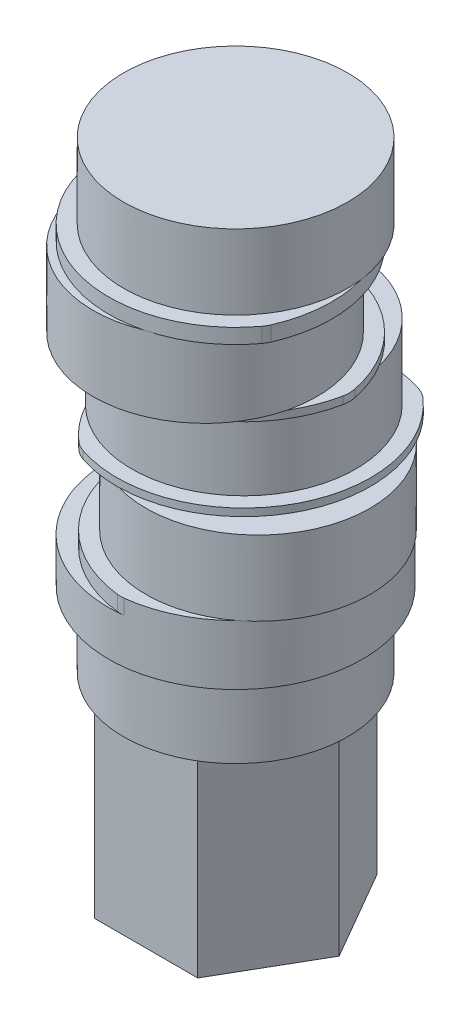
ISO-10303-21;
HEADER;
FILE_DESCRIPTION(('STEP AP214'),'2;1');
FILE_NAME('part.step','',(''),(''),'','','');
FILE_SCHEMA(('AUTOMOTIVE_DESIGN { 1 0 10303 214 1 1 1 1 }'));
ENDSEC;
DATA;
#1=APPLICATION_CONTEXT('core data for automotive mechanical design processes');
#2=APPLICATION_PROTOCOL_DEFINITION('international standard','automotive_design',2000,#1);
#3=PRODUCT_CONTEXT('',#1,'mechanical');
#4=PRODUCT('Part','Part','',(#3));
#5=PRODUCT_RELATED_PRODUCT_CATEGORY('part','',(#4));
#6=PRODUCT_DEFINITION_FORMATION('','',#4);
#7=PRODUCT_DEFINITION_CONTEXT('part definition',#1,'design');
#8=PRODUCT_DEFINITION('design','',#6,#7);
#9=PRODUCT_DEFINITION_SHAPE('','',#8);
#10=(LENGTH_UNIT() NAMED_UNIT(*) SI_UNIT(.MILLI.,.METRE.));
#11=(NAMED_UNIT(*) PLANE_ANGLE_UNIT() SI_UNIT($,.RADIAN.));
#12=(NAMED_UNIT(*) SI_UNIT($,.STERADIAN.) SOLID_ANGLE_UNIT());
#13=UNCERTAINTY_MEASURE_WITH_UNIT(LENGTH_MEASURE(1.E-05),#10,'distance_accuracy_value','');
#14=(GEOMETRIC_REPRESENTATION_CONTEXT(3) GLOBAL_UNCERTAINTY_ASSIGNED_CONTEXT((#13)) GLOBAL_UNIT_ASSIGNED_CONTEXT((#10,
#11,#12)) REPRESENTATION_CONTEXT('',''));
#15=CARTESIAN_POINT('',(0.,0.,0.));
#16=DIRECTION('',(0.,0.,1.));
#17=DIRECTION('',(1.,0.,0.));
#18=AXIS2_PLACEMENT_3D('',#15,#16,#17);
#19=CARTESIAN_POINT('',(0.,21.,0.));
#20=DIRECTION('',(0.,1.,0.));
#21=DIRECTION('',(0.,0.,1.));
#22=AXIS2_PLACEMENT_3D('',#19,#20,#21);
#23=PLANE('',#22);
#24=CARTESIAN_POINT('',(1.5,21.,0.));
#25=DIRECTION('',(0.,1.,0.));
#26=DIRECTION('',(0.,0.,1.));
#27=AXIS2_PLACEMENT_3D('',#24,#25,#26);
#28=CIRCLE('',#27,8.5);
#29=CARTESIAN_POINT('',(0.519230769230769,21.,-8.44322756509478));
#30=VERTEX_POINT('',#29);
#31=CARTESIAN_POINT('',(0.519230769230769,21.,8.44322756509478));
#32=VERTEX_POINT('',#31);
#33=EDGE_CURVE('E233',#30,#32,#28,.T.);
#34=ORIENTED_EDGE('',*,*,#33,.F.);
#35=CARTESIAN_POINT('',(0.75,21.,-6.45658578507248));
#36=DIRECTION('',(0.,1.,0.));
#37=DIRECTION('',(0.,0.,1.));
#38=AXIS2_PLACEMENT_3D('',#35,#36,#37);
#39=CIRCLE('',#38,2.);
#40=CARTESIAN_POINT('',(0.980769230769231,21.,-8.44322756509478));
#41=VERTEX_POINT('',#40);
#42=EDGE_CURVE('E260',#30,#41,#39,.F.);
#43=ORIENTED_EDGE('',*,*,#42,.T.);
#44=CARTESIAN_POINT('',(0.,21.,0.));
#45=DIRECTION('',(0.,-1.,0.));
#46=DIRECTION('',(0.,0.,-1.));
#47=AXIS2_PLACEMENT_3D('',#44,#45,#46);
#48=CIRCLE('',#47,8.5);
#49=CARTESIAN_POINT('',(0.980769230769231,21.,8.44322756509478));
#50=VERTEX_POINT('',#49);
#51=EDGE_CURVE('E259',#50,#41,#48,.T.);
#52=ORIENTED_EDGE('',*,*,#51,.F.);
#53=CARTESIAN_POINT('',(0.75,21.,6.45658578507248));
#54=DIRECTION('',(0.,1.,0.));
#55=DIRECTION('',(0.,0.,1.));
#56=AXIS2_PLACEMENT_3D('',#53,#54,#55);
#57=CIRCLE('',#56,2.);
#58=EDGE_CURVE('E252',#50,#32,#57,.F.);
#59=ORIENTED_EDGE('',*,*,#58,.T.);
#60=EDGE_LOOP('',(#34,#43,#52,#59));
#61=FACE_BOUND('',#60,.T.);
#62=ADVANCED_FACE('F41',(#61),#23,.T.);
#63=CARTESIAN_POINT('',(1.5,22.,0.));
#64=DIRECTION('',(0.,-1.,0.));
#65=DIRECTION('',(0.,0.,-1.));
#66=AXIS2_PLACEMENT_3D('',#63,#64,#65);
#67=CYLINDRICAL_SURFACE('',#66,8.5);
#68=CARTESIAN_POINT('',(1.5,22.,0.));
#69=DIRECTION('',(0.,1.,0.));
#70=DIRECTION('',(0.,0.,1.));
#71=AXIS2_PLACEMENT_3D('',#68,#69,#70);
#72=CIRCLE('',#71,8.5);
#73=CARTESIAN_POINT('',(0.519230769230769,22.,-8.44322756509478));
#74=VERTEX_POINT('',#73);
#75=CARTESIAN_POINT('',(0.519230769230769,22.,8.44322756509478));
#76=VERTEX_POINT('',#75);
#77=EDGE_CURVE('E350',#74,#76,#72,.T.);
#78=ORIENTED_EDGE('',*,*,#77,.F.);
#79=DIRECTION('',(0.,-1.,0.));
#80=VECTOR('',#79,1.);
#81=CARTESIAN_POINT('',(0.519230769230769,22.,-8.44322756509478));
#82=LINE('',#81,#80);
#83=EDGE_CURVE('E240',#74,#30,#82,.T.);
#84=ORIENTED_EDGE('',*,*,#83,.T.);
#85=ORIENTED_EDGE('',*,*,#33,.T.);
#86=DIRECTION('',(0.,-1.,0.));
#87=VECTOR('',#86,1.);
#88=CARTESIAN_POINT('',(0.519230769230769,22.,8.44322756509478));
#89=LINE('',#88,#87);
#90=EDGE_CURVE('E237',#32,#76,#89,.F.);
#91=ORIENTED_EDGE('',*,*,#90,.T.);
#92=EDGE_LOOP('',(#78,#84,#85,#91));
#93=FACE_BOUND('',#92,.T.);
#94=ADVANCED_FACE('F236',(#93),#67,.T.);
#95=CARTESIAN_POINT('',(0.,22.,0.));
#96=DIRECTION('',(0.,-1.,0.));
#97=DIRECTION('',(0.,0.,-1.));
#98=AXIS2_PLACEMENT_3D('',#95,#96,#97);
#99=CYLINDRICAL_SURFACE('',#98,8.5);
#100=DIRECTION('',(0.,-1.,0.));
#101=VECTOR('',#100,1.);
#102=CARTESIAN_POINT('',(0.980769230769231,22.,8.44322756509478));
#103=LINE('',#102,#101);
#104=CARTESIAN_POINT('',(0.980769230769231,22.,8.44322756509478));
#105=VERTEX_POINT('',#104);
#106=EDGE_CURVE('E262',#105,#50,#103,.T.);
#107=ORIENTED_EDGE('',*,*,#106,.T.);
#108=ORIENTED_EDGE('',*,*,#51,.T.);
#109=DIRECTION('',(0.,-1.,0.));
#110=VECTOR('',#109,1.);
#111=CARTESIAN_POINT('',(0.980769230769231,22.,-8.44322756509478));
#112=LINE('',#111,#110);
#113=CARTESIAN_POINT('',(0.980769230769231,22.,-8.44322756509478));
#114=VERTEX_POINT('',#113);
#115=EDGE_CURVE('E267',#41,#114,#112,.F.);
#116=ORIENTED_EDGE('',*,*,#115,.T.);
#117=CARTESIAN_POINT('',(0.,22.,0.));
#118=DIRECTION('',(0.,1.,0.));
#119=DIRECTION('',(0.,0.,1.));
#120=AXIS2_PLACEMENT_3D('',#117,#118,#119);
#121=CIRCLE('',#120,8.5);
#122=CARTESIAN_POINT('',(6.08333333333334,22.,-5.93658618698958));
#123=VERTEX_POINT('',#122);
#124=EDGE_CURVE('E355',#123,#114,#121,.T.);
#125=ORIENTED_EDGE('',*,*,#124,.F.);
#126=CARTESIAN_POINT('',(6.08333333333334,22.,5.93658618698958));
#127=VERTEX_POINT('',#126);
#128=EDGE_CURVE('E358',#127,#123,#121,.T.);
#129=ORIENTED_EDGE('',*,*,#128,.F.);
#130=EDGE_CURVE('E356',#105,#127,#121,.T.);
#131=ORIENTED_EDGE('',*,*,#130,.F.);
#132=EDGE_LOOP('',(#107,#108,#116,#125,#129,#131));
#133=FACE_BOUND('',#132,.T.);
#134=CARTESIAN_POINT('',(0.,18.,0.));
#135=DIRECTION('',(0.,-1.,0.));
#136=DIRECTION('',(0.,0.,-1.));
#137=AXIS2_PLACEMENT_3D('',#134,#135,#136);
#138=CIRCLE('',#137,8.5);
#139=CARTESIAN_POINT('',(0.,18.,-8.5));
#140=VERTEX_POINT('',#139);
#141=EDGE_CURVE('E962',#140,#140,#138,.T.);
#142=ORIENTED_EDGE('',*,*,#141,.F.);
#143=EDGE_LOOP('',(#142));
#144=FACE_BOUND('',#143,.T.);
#145=ADVANCED_FACE('F519',(#133,#144),#99,.T.);
#146=CARTESIAN_POINT('',(0.,22.,0.));
#147=DIRECTION('',(0.,1.,0.));
#148=DIRECTION('',(0.,0.,1.));
#149=AXIS2_PLACEMENT_3D('',#146,#147,#148);
#150=PLANE('',#149);
#151=ORIENTED_EDGE('',*,*,#124,.T.);
#152=CARTESIAN_POINT('',(0.75,22.,-6.45658578507248));
#153=DIRECTION('',(0.,1.,0.));
#154=DIRECTION('',(0.,0.,1.));
#155=AXIS2_PLACEMENT_3D('',#152,#153,#154);
#156=CIRCLE('',#155,2.);
#157=EDGE_CURVE('E270',#114,#74,#156,.T.);
#158=ORIENTED_EDGE('',*,*,#157,.T.);
#159=ORIENTED_EDGE('',*,*,#77,.T.);
#160=CARTESIAN_POINT('',(0.75,22.,6.45658578507248));
#161=DIRECTION('',(0.,1.,0.));
#162=DIRECTION('',(0.,0.,1.));
#163=AXIS2_PLACEMENT_3D('',#160,#161,#162);
#164=CIRCLE('',#163,2.);
#165=EDGE_CURVE('E254',#76,#105,#164,.T.);
#166=ORIENTED_EDGE('',*,*,#165,.T.);
#167=ORIENTED_EDGE('',*,*,#130,.T.);
#168=CARTESIAN_POINT('',(1.5,22.,0.));
#169=DIRECTION('',(0.,1.,0.));
#170=DIRECTION('',(0.,0.,1.));
#171=AXIS2_PLACEMENT_3D('',#168,#169,#170);
#172=CIRCLE('',#171,7.5);
#173=EDGE_CURVE('E245',#123,#127,#172,.T.);
#174=ORIENTED_EDGE('',*,*,#173,.F.);
#175=EDGE_LOOP('',(#151,#158,#159,#166,#167,#174));
#176=FACE_BOUND('',#175,.T.);
#177=ADVANCED_FACE('F713',(#176),#150,.T.);
#178=CARTESIAN_POINT('',(1.5,22.,0.));
#179=DIRECTION('',(0.,1.,0.));
#180=DIRECTION('',(0.,0.,1.));
#181=AXIS2_PLACEMENT_3D('',#178,#179,#180);
#182=PLANE('',#181);
#183=EDGE_CURVE('E340',#127,#123,#172,.T.);
#184=ORIENTED_EDGE('',*,*,#183,.F.);
#185=ORIENTED_EDGE('',*,*,#128,.T.);
#186=EDGE_LOOP('',(#184,#185));
#187=FACE_BOUND('',#186,.T.);
#188=ADVANCED_FACE('F853',(#187),#182,.F.);
#189=CARTESIAN_POINT('',(1.5,27.,0.));
#190=DIRECTION('',(0.,-1.,0.));
#191=DIRECTION('',(0.,0.,-1.));
#192=AXIS2_PLACEMENT_3D('',#189,#190,#191);
#193=CYLINDRICAL_SURFACE('',#192,7.5);
#194=CARTESIAN_POINT('',(1.5,27.,0.));
#195=DIRECTION('',(0.,1.,0.));
#196=DIRECTION('',(0.,0.,1.));
#197=AXIS2_PLACEMENT_3D('',#194,#195,#196);
#198=CIRCLE('',#197,7.5);
#199=CARTESIAN_POINT('',(6.68450273621876,27.,-5.41949549110803));
#200=VERTEX_POINT('',#199);
#201=CARTESIAN_POINT('',(-0.601169402885409,27.,7.19965882110938));
#202=VERTEX_POINT('',#201);
#203=EDGE_CURVE('E347',#200,#202,#198,.T.);
#204=ORIENTED_EDGE('',*,*,#203,.F.);
#205=EDGE_CURVE('E351',#202,#200,#198,.T.);
#206=ORIENTED_EDGE('',*,*,#205,.F.);
#207=EDGE_LOOP('',(#204,#206));
#208=FACE_BOUND('',#207,.T.);
#209=ORIENTED_EDGE('',*,*,#183,.T.);
#210=ORIENTED_EDGE('',*,*,#173,.T.);
#211=EDGE_LOOP('',(#209,#210));
#212=FACE_BOUND('',#211,.T.);
#213=ADVANCED_FACE('F844',(#208,#212),#193,.T.);
#214=CARTESIAN_POINT('',(1.5,27.,0.));
#215=DIRECTION('',(0.,1.,0.));
#216=DIRECTION('',(0.,0.,1.));
#217=AXIS2_PLACEMENT_3D('',#214,#215,#216);
#218=PLANE('',#217);
#219=CARTESIAN_POINT('',(-0.749999999999997,27.,-1.29903810567666));
#220=DIRECTION('',(0.,1.,0.));
#221=DIRECTION('',(0.,0.,1.));
#222=AXIS2_PLACEMENT_3D('',#219,#220,#221);
#223=CIRCLE('',#222,8.5);
#224=EDGE_CURVE('E344',#202,#200,#223,.T.);
#225=ORIENTED_EDGE('',*,*,#224,.F.);
#226=ORIENTED_EDGE('',*,*,#205,.T.);
#227=EDGE_LOOP('',(#225,#226));
#228=FACE_BOUND('',#227,.T.);
#229=ADVANCED_FACE('F835',(#228),#218,.T.);
#230=CARTESIAN_POINT('',(0.,27.,0.));
#231=DIRECTION('',(0.,1.,0.));
#232=DIRECTION('',(0.,0.,1.));
#233=AXIS2_PLACEMENT_3D('',#230,#231,#232);
#234=PLANE('',#233);
#235=CARTESIAN_POINT('',(-3.44310704708787,27.,6.76304440648641));
#236=VERTEX_POINT('',#235);
#237=EDGE_CURVE('E342',#236,#202,#223,.T.);
#238=ORIENTED_EDGE('',*,*,#237,.F.);
#239=CARTESIAN_POINT('',(-2.80943480071425,27.,4.86608381538922));
#240=DIRECTION('',(0.,1.,0.));
#241=DIRECTION('',(0.,0.,1.));
#242=AXIS2_PLACEMENT_3D('',#239,#240,#241);
#243=CIRCLE('',#242,2.);
#244=CARTESIAN_POINT('',(-4.13541473939556,27.,6.36334037397052));
#245=VERTEX_POINT('',#244);
#246=EDGE_CURVE('E279',#236,#245,#243,.F.);
#247=ORIENTED_EDGE('',*,*,#246,.T.);
#248=CARTESIAN_POINT('',(1.5,27.,0.));
#249=DIRECTION('',(0.,1.,0.));
#250=DIRECTION('',(0.,0.,1.));
#251=AXIS2_PLACEMENT_3D('',#248,#249,#250);
#252=CIRCLE('',#251,8.5);
#253=CARTESIAN_POINT('',(4.19310704708788,27.,-8.06208251216307));
#254=VERTEX_POINT('',#253);
#255=EDGE_CURVE('E337',#254,#245,#252,.T.);
#256=ORIENTED_EDGE('',*,*,#255,.F.);
#257=CARTESIAN_POINT('',(3.55943480071426,27.,-6.16512192106588));
#258=DIRECTION('',(0.,1.,0.));
#259=DIRECTION('',(0.,0.,1.));
#260=AXIS2_PLACEMENT_3D('',#257,#258,#259);
#261=CIRCLE('',#260,2.);
#262=CARTESIAN_POINT('',(4.88541473939557,27.,-7.66237847964718));
#263=VERTEX_POINT('',#262);
#264=EDGE_CURVE('E277',#254,#263,#261,.F.);
#265=ORIENTED_EDGE('',*,*,#264,.T.);
#266=EDGE_CURVE('E327',#200,#263,#223,.T.);
#267=ORIENTED_EDGE('',*,*,#266,.F.);
#268=ORIENTED_EDGE('',*,*,#203,.T.);
#269=EDGE_LOOP('',(#238,#247,#256,#265,#267,#268));
#270=FACE_BOUND('',#269,.T.);
#271=ADVANCED_FACE('F825',(#270),#234,.F.);
#272=CARTESIAN_POINT('',(-0.749999999999997,27.5,-1.29903810567666));
#273=DIRECTION('',(0.,-1.,0.));
#274=DIRECTION('',(0.,0.,-1.));
#275=AXIS2_PLACEMENT_3D('',#272,#273,#274);
#276=CYLINDRICAL_SURFACE('',#275,8.5);
#277=CARTESIAN_POINT('',(-0.749999999999997,27.5,-1.29903810567666));
#278=DIRECTION('',(0.,1.,0.));
#279=DIRECTION('',(0.,0.,1.));
#280=AXIS2_PLACEMENT_3D('',#277,#278,#279);
#281=CIRCLE('',#280,8.5);
#282=CARTESIAN_POINT('',(-3.44310704708787,27.5,6.76304440648641));
#283=VERTEX_POINT('',#282);
#284=CARTESIAN_POINT('',(4.88541473939557,27.5,-7.66237847964718));
#285=VERTEX_POINT('',#284);
#286=EDGE_CURVE('E333',#283,#285,#281,.T.);
#287=ORIENTED_EDGE('',*,*,#286,.F.);
#288=DIRECTION('',(0.,-1.,0.));
#289=VECTOR('',#288,1.);
#290=CARTESIAN_POINT('',(-3.44310704708787,27.5,6.76304440648641));
#291=LINE('',#290,#289);
#292=EDGE_CURVE('E274',#283,#236,#291,.T.);
#293=ORIENTED_EDGE('',*,*,#292,.T.);
#294=ORIENTED_EDGE('',*,*,#237,.T.);
#295=ORIENTED_EDGE('',*,*,#224,.T.);
#296=ORIENTED_EDGE('',*,*,#266,.T.);
#297=DIRECTION('',(0.,-1.,0.));
#298=VECTOR('',#297,1.);
#299=CARTESIAN_POINT('',(4.88541473939557,27.5,-7.66237847964718));
#300=LINE('',#299,#298);
#301=EDGE_CURVE('E272',#263,#285,#300,.F.);
#302=ORIENTED_EDGE('',*,*,#301,.T.);
#303=EDGE_LOOP('',(#287,#293,#294,#295,#296,#302));
#304=FACE_BOUND('',#303,.T.);
#305=ADVANCED_FACE('F816',(#304),#276,.T.);
#306=CARTESIAN_POINT('',(1.5,27.5,0.));
#307=DIRECTION('',(0.,-1.,0.));
#308=DIRECTION('',(0.,0.,-1.));
#309=AXIS2_PLACEMENT_3D('',#306,#307,#308);
#310=CYLINDRICAL_SURFACE('',#309,8.5);
#311=ORIENTED_EDGE('',*,*,#255,.T.);
#312=DIRECTION('',(0.,-1.,0.));
#313=VECTOR('',#312,1.);
#314=CARTESIAN_POINT('',(-4.13541473939556,27.5,6.36334037397052));
#315=LINE('',#314,#313);
#316=CARTESIAN_POINT('',(-4.13541473939556,27.5,6.36334037397052));
#317=VERTEX_POINT('',#316);
#318=EDGE_CURVE('E284',#245,#317,#315,.F.);
#319=ORIENTED_EDGE('',*,*,#318,.T.);
#320=CARTESIAN_POINT('',(1.5,27.5,0.));
#321=DIRECTION('',(0.,1.,0.));
#322=DIRECTION('',(0.,0.,1.));
#323=AXIS2_PLACEMENT_3D('',#320,#321,#322);
#324=CIRCLE('',#323,8.5);
#325=CARTESIAN_POINT('',(-5.93450273621875,27.5,4.12045738543137));
#326=VERTEX_POINT('',#325);
#327=EDGE_CURVE('E336',#326,#317,#324,.T.);
#328=ORIENTED_EDGE('',*,*,#327,.F.);
#329=CARTESIAN_POINT('',(1.35116940288542,27.5,-8.49869692678604));
#330=VERTEX_POINT('',#329);
#331=EDGE_CURVE('E341',#330,#326,#324,.T.);
#332=ORIENTED_EDGE('',*,*,#331,.F.);
#333=CARTESIAN_POINT('',(4.19310704708788,27.5,-8.06208251216307));
#334=VERTEX_POINT('',#333);
#335=EDGE_CURVE('E338',#334,#330,#324,.T.);
#336=ORIENTED_EDGE('',*,*,#335,.F.);
#337=DIRECTION('',(0.,-1.,0.));
#338=VECTOR('',#337,1.);
#339=CARTESIAN_POINT('',(4.19310704708788,27.5,-8.06208251216307));
#340=LINE('',#339,#338);
#341=EDGE_CURVE('E281',#334,#254,#340,.T.);
#342=ORIENTED_EDGE('',*,*,#341,.T.);
#343=EDGE_LOOP('',(#311,#319,#328,#332,#336,#342));
#344=FACE_BOUND('',#343,.T.);
#345=ADVANCED_FACE('F807',(#344),#310,.T.);
#346=CARTESIAN_POINT('',(0.,27.5,0.));
#347=DIRECTION('',(0.,1.,0.));
#348=DIRECTION('',(0.,0.,1.));
#349=AXIS2_PLACEMENT_3D('',#346,#347,#348);
#350=PLANE('',#349);
#351=ORIENTED_EDGE('',*,*,#327,.T.);
#352=CARTESIAN_POINT('',(-2.80943480071425,27.5,4.86608381538922));
#353=DIRECTION('',(0.,1.,0.));
#354=DIRECTION('',(0.,0.,1.));
#355=AXIS2_PLACEMENT_3D('',#352,#353,#354);
#356=CIRCLE('',#355,2.);
#357=EDGE_CURVE('E288',#317,#283,#356,.T.);
#358=ORIENTED_EDGE('',*,*,#357,.T.);
#359=ORIENTED_EDGE('',*,*,#286,.T.);
#360=CARTESIAN_POINT('',(3.55943480071426,27.5,-6.16512192106588));
#361=DIRECTION('',(0.,1.,0.));
#362=DIRECTION('',(0.,0.,1.));
#363=AXIS2_PLACEMENT_3D('',#360,#361,#362);
#364=CIRCLE('',#363,2.);
#365=EDGE_CURVE('E286',#285,#334,#364,.T.);
#366=ORIENTED_EDGE('',*,*,#365,.T.);
#367=ORIENTED_EDGE('',*,*,#335,.T.);
#368=CARTESIAN_POINT('',(-0.749999999999997,27.5,-1.29903810567666));
#369=DIRECTION('',(0.,1.,0.));
#370=DIRECTION('',(0.,0.,1.));
#371=AXIS2_PLACEMENT_3D('',#368,#369,#370);
#372=CIRCLE('',#371,7.5);
#373=EDGE_CURVE('E332',#326,#330,#372,.T.);
#374=ORIENTED_EDGE('',*,*,#373,.F.);
#375=EDGE_LOOP('',(#351,#358,#359,#366,#367,#374));
#376=FACE_BOUND('',#375,.T.);
#377=ADVANCED_FACE('F799',(#376),#350,.T.);
#378=CARTESIAN_POINT('',(-0.749999999999997,27.5,-1.29903810567666));
#379=DIRECTION('',(0.,1.,0.));
#380=DIRECTION('',(0.,0.,1.));
#381=AXIS2_PLACEMENT_3D('',#378,#379,#380);
#382=PLANE('',#381);
#383=EDGE_CURVE('E329',#330,#326,#372,.T.);
#384=ORIENTED_EDGE('',*,*,#383,.F.);
#385=ORIENTED_EDGE('',*,*,#331,.T.);
#386=EDGE_LOOP('',(#384,#385));
#387=FACE_BOUND('',#386,.T.);
#388=ADVANCED_FACE('F509',(#387),#382,.F.);
#389=CARTESIAN_POINT('',(-0.749999999999997,32.5,-1.29903810567666));
#390=DIRECTION('',(0.,-1.,0.));
#391=DIRECTION('',(0.,0.,-1.));
#392=AXIS2_PLACEMENT_3D('',#389,#390,#391);
#393=CYLINDRICAL_SURFACE('',#392,7.5);
#394=CARTESIAN_POINT('',(-0.749999999999997,32.5,-1.29903810567666));
#395=DIRECTION('',(0.,1.,0.));
#396=DIRECTION('',(0.,0.,1.));
#397=AXIS2_PLACEMENT_3D('',#394,#395,#396);
#398=CIRCLE('',#397,7.5);
#399=CARTESIAN_POINT('',(6.53567213910416,32.5,-3.07920143567799));
#400=VERTEX_POINT('',#399);
#401=CARTESIAN_POINT('',(-8.03567213910414,32.5,-3.07920143567804));
#402=VERTEX_POINT('',#401);
#403=EDGE_CURVE('E325',#400,#402,#398,.T.);
#404=ORIENTED_EDGE('',*,*,#403,.F.);
#405=EDGE_CURVE('E328',#402,#400,#398,.T.);
#406=ORIENTED_EDGE('',*,*,#405,.F.);
#407=EDGE_LOOP('',(#404,#406));
#408=FACE_BOUND('',#407,.T.);
#409=ORIENTED_EDGE('',*,*,#383,.T.);
#410=ORIENTED_EDGE('',*,*,#373,.T.);
#411=EDGE_LOOP('',(#409,#410));
#412=FACE_BOUND('',#411,.T.);
#413=ADVANCED_FACE('F497',(#408,#412),#393,.T.);
#414=CARTESIAN_POINT('',(-0.749999999999997,32.5,-1.29903810567666));
#415=DIRECTION('',(0.,1.,0.));
#416=DIRECTION('',(0.,0.,1.));
#417=AXIS2_PLACEMENT_3D('',#414,#415,#416);
#418=PLANE('',#417);
#419=CARTESIAN_POINT('',(-0.750000000000006,32.5,1.29903810567665));
#420=DIRECTION('',(0.,1.,0.));
#421=DIRECTION('',(0.,0.,1.));
#422=AXIS2_PLACEMENT_3D('',#419,#420,#421);
#423=CIRCLE('',#422,8.5);
#424=EDGE_CURVE('E322',#400,#402,#423,.T.);
#425=ORIENTED_EDGE('',*,*,#424,.F.);
#426=ORIENTED_EDGE('',*,*,#403,.T.);
#427=EDGE_LOOP('',(#425,#426));
#428=FACE_BOUND('',#427,.T.);
#429=ADVANCED_FACE('F500',(#428),#418,.T.);
#430=CARTESIAN_POINT('',(0.,32.5,0.));
#431=DIRECTION('',(0.,1.,0.));
#432=DIRECTION('',(0.,0.,1.));
#433=AXIS2_PLACEMENT_3D('',#430,#431,#432);
#434=PLANE('',#433);
#435=CARTESIAN_POINT('',(7.57852178648342,32.5,-0.399704032515868));
#436=VERTEX_POINT('',#435);
#437=EDGE_CURVE('E316',#436,#400,#423,.T.);
#438=ORIENTED_EDGE('',*,*,#437,.F.);
#439=CARTESIAN_POINT('',(5.6188696014285,32.5,0.));
#440=DIRECTION('',(0.,1.,0.));
#441=DIRECTION('',(0.,0.,1.));
#442=AXIS2_PLACEMENT_3D('',#439,#440,#441);
#443=CIRCLE('',#442,2.);
#444=CARTESIAN_POINT('',(7.57852178648342,32.5,0.399704032515922));
#445=VERTEX_POINT('',#444);
#446=EDGE_CURVE('E297',#436,#445,#443,.F.);
#447=ORIENTED_EDGE('',*,*,#446,.T.);
#448=CARTESIAN_POINT('',(-0.749999999999997,32.5,-1.29903810567666));
#449=DIRECTION('',(0.,1.,0.));
#450=DIRECTION('',(0.,0.,1.));
#451=AXIS2_PLACEMENT_3D('',#448,#449,#450);
#452=CIRCLE('',#451,8.5);
#453=CARTESIAN_POINT('',(-9.07852178648343,32.5,0.399704032515863));
#454=VERTEX_POINT('',#453);
#455=EDGE_CURVE('E306',#454,#445,#452,.T.);
#456=ORIENTED_EDGE('',*,*,#455,.F.);
#457=CARTESIAN_POINT('',(-7.1188696014285,32.5,0.));
#458=DIRECTION('',(0.,1.,0.));
#459=DIRECTION('',(0.,0.,1.));
#460=AXIS2_PLACEMENT_3D('',#457,#458,#459);
#461=CIRCLE('',#460,2.);
#462=CARTESIAN_POINT('',(-9.07852178648342,32.5,-0.399704032515927));
#463=VERTEX_POINT('',#462);
#464=EDGE_CURVE('E295',#454,#463,#461,.F.);
#465=ORIENTED_EDGE('',*,*,#464,.T.);
#466=EDGE_CURVE('E320',#402,#463,#423,.T.);
#467=ORIENTED_EDGE('',*,*,#466,.F.);
#468=ORIENTED_EDGE('',*,*,#405,.T.);
#469=EDGE_LOOP('',(#438,#447,#456,#465,#467,#468));
#470=FACE_BOUND('',#469,.T.);
#471=ADVANCED_FACE('F312',(#470),#434,.F.);
#472=CARTESIAN_POINT('',(-0.750000000000006,33.,1.29903810567665));
#473=DIRECTION('',(0.,-1.,0.));
#474=DIRECTION('',(0.,0.,-1.));
#475=AXIS2_PLACEMENT_3D('',#472,#473,#474);
#476=CYLINDRICAL_SURFACE('',#475,8.5);
#477=CARTESIAN_POINT('',(-0.750000000000006,33.,1.29903810567665));
#478=DIRECTION('',(0.,1.,0.));
#479=DIRECTION('',(0.,0.,1.));
#480=AXIS2_PLACEMENT_3D('',#477,#478,#479);
#481=CIRCLE('',#480,8.5);
#482=CARTESIAN_POINT('',(7.57852178648342,33.,-0.399704032515868));
#483=VERTEX_POINT('',#482);
#484=CARTESIAN_POINT('',(-9.07852178648342,33.,-0.399704032515927));
#485=VERTEX_POINT('',#484);
#486=EDGE_CURVE('E315',#483,#485,#481,.T.);
#487=ORIENTED_EDGE('',*,*,#486,.F.);
#488=DIRECTION('',(0.,-1.,0.));
#489=VECTOR('',#488,1.);
#490=CARTESIAN_POINT('',(7.57852178648342,33.,-0.399704032515867));
#491=LINE('',#490,#489);
#492=EDGE_CURVE('E292',#483,#436,#491,.T.);
#493=ORIENTED_EDGE('',*,*,#492,.T.);
#494=ORIENTED_EDGE('',*,*,#437,.T.);
#495=ORIENTED_EDGE('',*,*,#424,.T.);
#496=ORIENTED_EDGE('',*,*,#466,.T.);
#497=DIRECTION('',(0.,-1.,0.));
#498=VECTOR('',#497,1.);
#499=CARTESIAN_POINT('',(-9.07852178648342,33.,-0.399704032515927));
#500=LINE('',#499,#498);
#501=EDGE_CURVE('E290',#463,#485,#500,.F.);
#502=ORIENTED_EDGE('',*,*,#501,.T.);
#503=EDGE_LOOP('',(#487,#493,#494,#495,#496,#502));
#504=FACE_BOUND('',#503,.T.);
#505=ADVANCED_FACE('F492',(#504),#476,.T.);
#506=CARTESIAN_POINT('',(-0.749999999999997,33.,-1.29903810567666));
#507=DIRECTION('',(0.,-1.,0.));
#508=DIRECTION('',(0.,0.,-1.));
#509=AXIS2_PLACEMENT_3D('',#506,#507,#508);
#510=CYLINDRICAL_SURFACE('',#509,8.5);
#511=ORIENTED_EDGE('',*,*,#455,.T.);
#512=DIRECTION('',(0.,-1.,0.));
#513=VECTOR('',#512,1.);
#514=CARTESIAN_POINT('',(7.57852178648342,33.,0.399704032515922));
#515=LINE('',#514,#513);
#516=CARTESIAN_POINT('',(7.57852178648342,33.,0.399704032515922));
#517=VERTEX_POINT('',#516);
#518=EDGE_CURVE('E64',#445,#517,#515,.F.);
#519=ORIENTED_EDGE('',*,*,#518,.T.);
#520=CARTESIAN_POINT('',(-0.749999999999997,33.,-1.29903810567666));
#521=DIRECTION('',(0.,1.,0.));
#522=DIRECTION('',(0.,0.,1.));
#523=AXIS2_PLACEMENT_3D('',#520,#521,#522);
#524=CIRCLE('',#523,8.5);
#525=CARTESIAN_POINT('',(6.53567213910414,33.,3.07920143567803));
#526=VERTEX_POINT('',#525);
#527=EDGE_CURVE('E318',#526,#517,#524,.T.);
#528=ORIENTED_EDGE('',*,*,#527,.F.);
#529=CARTESIAN_POINT('',(-8.03567213910417,33.,3.07920143567798));
#530=VERTEX_POINT('',#529);
#531=EDGE_CURVE('E484',#530,#526,#524,.T.);
#532=ORIENTED_EDGE('',*,*,#531,.F.);
#533=CARTESIAN_POINT('',(-9.07852178648343,33.,0.399704032515863));
#534=VERTEX_POINT('',#533);
#535=EDGE_CURVE('E308',#534,#530,#524,.T.);
#536=ORIENTED_EDGE('',*,*,#535,.F.);
#537=DIRECTION('',(0.,-1.,0.));
#538=VECTOR('',#537,1.);
#539=CARTESIAN_POINT('',(-9.07852178648342,33.,0.399704032515862));
#540=LINE('',#539,#538);
#541=EDGE_CURVE('E299',#534,#454,#540,.T.);
#542=ORIENTED_EDGE('',*,*,#541,.T.);
#543=EDGE_LOOP('',(#511,#519,#528,#532,#536,#542));
#544=FACE_BOUND('',#543,.T.);
#545=ADVANCED_FACE('F305',(#544),#510,.T.);
#546=CARTESIAN_POINT('',(0.,33.,0.));
#547=DIRECTION('',(0.,1.,0.));
#548=DIRECTION('',(0.,0.,1.));
#549=AXIS2_PLACEMENT_3D('',#546,#547,#548);
#550=PLANE('',#549);
#551=ORIENTED_EDGE('',*,*,#527,.T.);
#552=CARTESIAN_POINT('',(5.6188696014285,33.,0.));
#553=DIRECTION('',(0.,1.,0.));
#554=DIRECTION('',(0.,0.,1.));
#555=AXIS2_PLACEMENT_3D('',#552,#553,#554);
#556=CIRCLE('',#555,2.);
#557=EDGE_CURVE('E11',#517,#483,#556,.T.);
#558=ORIENTED_EDGE('',*,*,#557,.T.);
#559=ORIENTED_EDGE('',*,*,#486,.T.);
#560=CARTESIAN_POINT('',(-7.1188696014285,33.,0.));
#561=DIRECTION('',(0.,1.,0.));
#562=DIRECTION('',(0.,0.,1.));
#563=AXIS2_PLACEMENT_3D('',#560,#561,#562);
#564=CIRCLE('',#563,2.);
#565=EDGE_CURVE('E50',#485,#534,#564,.T.);
#566=ORIENTED_EDGE('',*,*,#565,.T.);
#567=ORIENTED_EDGE('',*,*,#535,.T.);
#568=CARTESIAN_POINT('',(-0.750000000000006,33.,1.29903810567665));
#569=DIRECTION('',(0.,1.,0.));
#570=DIRECTION('',(0.,0.,1.));
#571=AXIS2_PLACEMENT_3D('',#568,#569,#570);
#572=CIRCLE('',#571,7.5);
#573=EDGE_CURVE('E481',#526,#530,#572,.T.);
#574=ORIENTED_EDGE('',*,*,#573,.F.);
#575=EDGE_LOOP('',(#551,#558,#559,#566,#567,#574));
#576=FACE_BOUND('',#575,.T.);
#577=ADVANCED_FACE('F487',(#576),#550,.T.);
#578=CARTESIAN_POINT('',(-0.750000000000006,33.,1.29903810567665));
#579=DIRECTION('',(0.,1.,0.));
#580=DIRECTION('',(0.,0.,1.));
#581=AXIS2_PLACEMENT_3D('',#578,#579,#580);
#582=PLANE('',#581);
#583=EDGE_CURVE('E447',#530,#526,#572,.T.);
#584=ORIENTED_EDGE('',*,*,#583,.F.);
#585=ORIENTED_EDGE('',*,*,#531,.T.);
#586=EDGE_LOOP('',(#584,#585));
#587=FACE_BOUND('',#586,.T.);
#588=ADVANCED_FACE('F617',(#587),#582,.F.);
#589=CARTESIAN_POINT('',(-0.750000000000006,38.,1.29903810567665));
#590=DIRECTION('',(0.,-1.,0.));
#591=DIRECTION('',(0.,0.,-1.));
#592=AXIS2_PLACEMENT_3D('',#589,#590,#591);
#593=CYLINDRICAL_SURFACE('',#592,7.5);
#594=CARTESIAN_POINT('',(-0.750000000000006,38.,1.29903810567665));
#595=DIRECTION('',(0.,1.,0.));
#596=DIRECTION('',(0.,0.,1.));
#597=AXIS2_PLACEMENT_3D('',#594,#595,#596);
#598=CIRCLE('',#597,7.5);
#599=CARTESIAN_POINT('',(2.09956778302207,38.,8.23661429985014));
#600=VERTEX_POINT('',#599);
#601=CARTESIAN_POINT('',(-8.18290111635545,38.,2.30002811286051));
#602=VERTEX_POINT('',#601);
#603=EDGE_CURVE('E475',#600,#602,#598,.T.);
#604=ORIENTED_EDGE('',*,*,#603,.F.);
#605=EDGE_CURVE('E477',#602,#600,#598,.T.);
#606=ORIENTED_EDGE('',*,*,#605,.F.);
#607=EDGE_LOOP('',(#604,#606));
#608=FACE_BOUND('',#607,.T.);
#609=ORIENTED_EDGE('',*,*,#573,.T.);
#610=ORIENTED_EDGE('',*,*,#583,.T.);
#611=EDGE_LOOP('',(#609,#610));
#612=FACE_BOUND('',#611,.T.);
#613=ADVANCED_FACE('F615',(#608,#612),#593,.T.);
#614=CARTESIAN_POINT('',(-0.750000000000006,38.,1.29903810567665));
#615=DIRECTION('',(0.,1.,0.));
#616=DIRECTION('',(0.,0.,1.));
#617=AXIS2_PLACEMENT_3D('',#614,#615,#616);
#618=PLANE('',#617);
#619=CARTESIAN_POINT('',(0.,38.,0.));
#620=DIRECTION('',(0.,1.,0.));
#621=DIRECTION('',(0.,0.,1.));
#622=AXIS2_PLACEMENT_3D('',#619,#620,#621);
#623=CIRCLE('',#622,8.5);
#624=EDGE_CURVE('E462',#602,#600,#623,.T.);
#625=ORIENTED_EDGE('',*,*,#624,.F.);
#626=ORIENTED_EDGE('',*,*,#605,.T.);
#627=EDGE_LOOP('',(#625,#626));
#628=FACE_BOUND('',#627,.T.);
#629=ADVANCED_FACE('F608',(#628),#618,.T.);
#630=CARTESIAN_POINT('',(0.,38.,0.));
#631=DIRECTION('',(0.,1.,0.));
#632=DIRECTION('',(0.,0.,1.));
#633=AXIS2_PLACEMENT_3D('',#630,#631,#632);
#634=PLANE('',#633);
#635=CARTESIAN_POINT('',(-0.750000000000006,38.,1.29903810567665));
#636=DIRECTION('',(0.,1.,0.));
#637=DIRECTION('',(0.,0.,1.));
#638=AXIS2_PLACEMENT_3D('',#635,#636,#637);
#639=CIRCLE('',#638,8.5);
#640=CARTESIAN_POINT('',(7.0524341766897,38.,4.67128081912781));
#641=VERTEX_POINT('',#640);
#642=CARTESIAN_POINT('',(-7.57166494592048,38.,-3.77194674596704));
#643=VERTEX_POINT('',#642);
#644=EDGE_CURVE('E458',#641,#643,#639,.T.);
#645=ORIENTED_EDGE('',*,*,#644,.F.);
#646=CARTESIAN_POINT('',(5.21656731158624,38.,3.87781194537459));
#647=DIRECTION('',(0.,1.,0.));
#648=DIRECTION('',(0.,0.,1.));
#649=AXIS2_PLACEMENT_3D('',#646,#647,#648);
#650=CIRCLE('',#649,2.);
#651=CARTESIAN_POINT('',(6.82166494592047,38.,5.0709848516437));
#652=VERTEX_POINT('',#651);
#653=EDGE_CURVE('E418',#641,#652,#650,.F.);
#654=ORIENTED_EDGE('',*,*,#653,.T.);
#655=EDGE_CURVE('E456',#600,#652,#623,.T.);
#656=ORIENTED_EDGE('',*,*,#655,.F.);
#657=ORIENTED_EDGE('',*,*,#603,.T.);
#658=CARTESIAN_POINT('',(-7.80243417668971,38.,-3.37224271345115));
#659=VERTEX_POINT('',#658);
#660=EDGE_CURVE('E463',#659,#602,#623,.T.);
#661=ORIENTED_EDGE('',*,*,#660,.F.);
#662=CARTESIAN_POINT('',(-5.96656731158625,38.,-2.57877383969794));
#663=DIRECTION('',(0.,1.,0.));
#664=DIRECTION('',(0.,0.,1.));
#665=AXIS2_PLACEMENT_3D('',#662,#663,#664);
#666=CIRCLE('',#665,2.);
#667=EDGE_CURVE('E416',#659,#643,#666,.F.);
#668=ORIENTED_EDGE('',*,*,#667,.T.);
#669=EDGE_LOOP('',(#645,#654,#656,#657,#661,#668));
#670=FACE_BOUND('',#669,.T.);
#671=ADVANCED_FACE('F454',(#670),#634,.F.);
#672=CARTESIAN_POINT('',(0.,39.,0.));
#673=DIRECTION('',(0.,-1.,0.));
#674=DIRECTION('',(0.,0.,-1.));
#675=AXIS2_PLACEMENT_3D('',#672,#673,#674);
#676=CYLINDRICAL_SURFACE('',#675,8.5);
#677=ORIENTED_EDGE('',*,*,#655,.T.);
#678=DIRECTION('',(0.,-1.,0.));
#679=VECTOR('',#678,1.);
#680=CARTESIAN_POINT('',(6.82166494592047,39.,5.0709848516437));
#681=LINE('',#680,#679);
#682=CARTESIAN_POINT('',(6.82166494592047,39.,5.0709848516437));
#683=VERTEX_POINT('',#682);
#684=EDGE_CURVE('E423',#652,#683,#681,.F.);
#685=ORIENTED_EDGE('',*,*,#684,.T.);
#686=CARTESIAN_POINT('',(0.,39.,0.));
#687=DIRECTION('',(0.,1.,0.));
#688=DIRECTION('',(0.,0.,1.));
#689=AXIS2_PLACEMENT_3D('',#686,#687,#688);
#690=CIRCLE('',#689,8.5);
#691=CARTESIAN_POINT('',(-7.80243417668971,39.,-3.37224271345115));
#692=VERTEX_POINT('',#691);
#693=EDGE_CURVE('E435',#692,#683,#690,.T.);
#694=ORIENTED_EDGE('',*,*,#693,.F.);
#695=DIRECTION('',(0.,-1.,0.));
#696=VECTOR('',#695,1.);
#697=CARTESIAN_POINT('',(-7.80243417668971,39.,-3.37224271345115));
#698=LINE('',#697,#696);
#699=EDGE_CURVE('E420',#692,#659,#698,.T.);
#700=ORIENTED_EDGE('',*,*,#699,.T.);
#701=ORIENTED_EDGE('',*,*,#660,.T.);
#702=ORIENTED_EDGE('',*,*,#624,.T.);
#703=EDGE_LOOP('',(#677,#685,#694,#700,#701,#702));
#704=FACE_BOUND('',#703,.T.);
#705=ADVANCED_FACE('F460',(#704),#676,.T.);
#706=CARTESIAN_POINT('',(-0.750000000000006,39.,1.29903810567665));
#707=DIRECTION('',(0.,-1.,0.));
#708=DIRECTION('',(0.,0.,-1.));
#709=AXIS2_PLACEMENT_3D('',#706,#707,#708);
#710=CYLINDRICAL_SURFACE('',#709,8.5);
#711=CARTESIAN_POINT('',(-0.750000000000006,39.,1.29903810567665));
#712=DIRECTION('',(0.,1.,0.));
#713=DIRECTION('',(0.,0.,1.));
#714=AXIS2_PLACEMENT_3D('',#711,#712,#713);
#715=CIRCLE('',#714,8.5);
#716=CARTESIAN_POINT('',(7.0524341766897,39.,4.67128081912781));
#717=VERTEX_POINT('',#716);
#718=CARTESIAN_POINT('',(7.43290111635545,39.,-1.00099000718385));
#719=VERTEX_POINT('',#718);
#720=EDGE_CURVE('E432',#717,#719,#715,.T.);
#721=ORIENTED_EDGE('',*,*,#720,.F.);
#722=DIRECTION('',(0.,-1.,0.));
#723=VECTOR('',#722,1.);
#724=CARTESIAN_POINT('',(7.0524341766897,39.,4.67128081912781));
#725=LINE('',#724,#723);
#726=EDGE_CURVE('E412',#717,#641,#725,.T.);
#727=ORIENTED_EDGE('',*,*,#726,.T.);
#728=ORIENTED_EDGE('',*,*,#644,.T.);
#729=DIRECTION('',(0.,-1.,0.));
#730=VECTOR('',#729,1.);
#731=CARTESIAN_POINT('',(-7.57166494592048,39.,-3.77194674596704));
#732=LINE('',#731,#730);
#733=CARTESIAN_POINT('',(-7.57166494592048,39.,-3.77194674596704));
#734=VERTEX_POINT('',#733);
#735=EDGE_CURVE('E410',#643,#734,#732,.F.);
#736=ORIENTED_EDGE('',*,*,#735,.T.);
#737=CARTESIAN_POINT('',(-2.84956778302207,39.,-6.93757619417348));
#738=VERTEX_POINT('',#737);
#739=EDGE_CURVE('E449',#738,#734,#715,.T.);
#740=ORIENTED_EDGE('',*,*,#739,.F.);
#741=EDGE_CURVE('E445',#719,#738,#715,.T.);
#742=ORIENTED_EDGE('',*,*,#741,.F.);
#743=EDGE_LOOP('',(#721,#727,#728,#736,#740,#742));
#744=FACE_BOUND('',#743,.T.);
#745=ADVANCED_FACE('F440',(#744),#710,.T.);
#746=CARTESIAN_POINT('',(0.,39.,0.));
#747=DIRECTION('',(0.,1.,0.));
#748=DIRECTION('',(0.,0.,1.));
#749=AXIS2_PLACEMENT_3D('',#746,#747,#748);
#750=PLANE('',#749);
#751=ORIENTED_EDGE('',*,*,#693,.T.);
#752=CARTESIAN_POINT('',(5.21656731158624,39.,3.87781194537459));
#753=DIRECTION('',(0.,1.,0.));
#754=DIRECTION('',(0.,0.,1.));
#755=AXIS2_PLACEMENT_3D('',#752,#753,#754);
#756=CIRCLE('',#755,2.);
#757=EDGE_CURVE('E255',#683,#717,#756,.T.);
#758=ORIENTED_EDGE('',*,*,#757,.T.);
#759=ORIENTED_EDGE('',*,*,#720,.T.);
#760=CARTESIAN_POINT('',(0.,39.,0.));
#761=DIRECTION('',(0.,1.,0.));
#762=DIRECTION('',(0.,0.,1.));
#763=AXIS2_PLACEMENT_3D('',#760,#761,#762);
#764=CIRCLE('',#763,7.5);
#765=EDGE_CURVE('E413',#738,#719,#764,.T.);
#766=ORIENTED_EDGE('',*,*,#765,.F.);
#767=ORIENTED_EDGE('',*,*,#739,.T.);
#768=CARTESIAN_POINT('',(-5.96656731158625,39.,-2.57877383969794));
#769=DIRECTION('',(0.,1.,0.));
#770=DIRECTION('',(0.,0.,1.));
#771=AXIS2_PLACEMENT_3D('',#768,#769,#770);
#772=CIRCLE('',#771,2.);
#773=EDGE_CURVE('E425',#734,#692,#772,.T.);
#774=ORIENTED_EDGE('',*,*,#773,.T.);
#775=EDGE_LOOP('',(#751,#758,#759,#766,#767,#774));
#776=FACE_BOUND('',#775,.T.);
#777=ADVANCED_FACE('F431',(#776),#750,.T.);
#778=CARTESIAN_POINT('',(0.,39.,0.));
#779=DIRECTION('',(0.,1.,0.));
#780=DIRECTION('',(0.,0.,1.));
#781=AXIS2_PLACEMENT_3D('',#778,#779,#780);
#782=PLANE('',#781);
#783=EDGE_CURVE('E467',#719,#738,#764,.T.);
#784=ORIENTED_EDGE('',*,*,#783,.F.);
#785=ORIENTED_EDGE('',*,*,#741,.T.);
#786=EDGE_LOOP('',(#784,#785));
#787=FACE_BOUND('',#786,.T.);
#788=ADVANCED_FACE('F597',(#787),#782,.F.);
#789=CARTESIAN_POINT('',(0.,44.,0.));
#790=DIRECTION('',(0.,-1.,0.));
#791=DIRECTION('',(0.,0.,-1.));
#792=AXIS2_PLACEMENT_3D('',#789,#790,#791);
#793=CYLINDRICAL_SURFACE('',#792,7.5);
#794=CARTESIAN_POINT('',(0.,44.,0.));
#795=DIRECTION('',(0.,1.,0.));
#796=DIRECTION('',(0.,0.,1.));
#797=AXIS2_PLACEMENT_3D('',#794,#795,#796);
#798=CIRCLE('',#797,7.5);
#799=CARTESIAN_POINT('',(0.,44.,7.5));
#800=VERTEX_POINT('',#799);
#801=EDGE_CURVE('E464',#800,#800,#798,.T.);
#802=ORIENTED_EDGE('',*,*,#801,.F.);
#803=EDGE_LOOP('',(#802));
#804=FACE_BOUND('',#803,.T.);
#805=ORIENTED_EDGE('',*,*,#783,.T.);
#806=ORIENTED_EDGE('',*,*,#765,.T.);
#807=EDGE_LOOP('',(#805,#806));
#808=FACE_BOUND('',#807,.T.);
#809=ADVANCED_FACE('F595',(#804,#808),#793,.T.);
#810=CARTESIAN_POINT('',(0.,44.,0.));
#811=DIRECTION('',(0.,1.,0.));
#812=DIRECTION('',(0.,0.,1.));
#813=AXIS2_PLACEMENT_3D('',#810,#811,#812);
#814=PLANE('',#813);
#815=ORIENTED_EDGE('',*,*,#801,.T.);
#816=EDGE_LOOP('',(#815));
#817=FACE_BOUND('',#816,.T.);
#818=ADVANCED_FACE('F563',(#817),#814,.T.);
#819=CARTESIAN_POINT('',(5.21656731158624,39.,3.87781194537459));
#820=DIRECTION('',(0.,-1.,0.));
#821=DIRECTION('',(0.,0.,-1.));
#822=AXIS2_PLACEMENT_3D('',#819,#820,#821);
#823=CYLINDRICAL_SURFACE('',#822,2.);
#824=ORIENTED_EDGE('',*,*,#757,.F.);
#825=ORIENTED_EDGE('',*,*,#684,.F.);
#826=ORIENTED_EDGE('',*,*,#653,.F.);
#827=ORIENTED_EDGE('',*,*,#726,.F.);
#828=EDGE_LOOP('',(#824,#825,#826,#827));
#829=FACE_BOUND('',#828,.T.);
#830=ADVANCED_FACE('F450',(#829),#823,.T.);
#831=CARTESIAN_POINT('',(-5.96656731158625,39.,-2.57877383969794));
#832=DIRECTION('',(0.,-1.,0.));
#833=DIRECTION('',(0.,0.,-1.));
#834=AXIS2_PLACEMENT_3D('',#831,#832,#833);
#835=CYLINDRICAL_SURFACE('',#834,2.);
#836=ORIENTED_EDGE('',*,*,#773,.F.);
#837=ORIENTED_EDGE('',*,*,#735,.F.);
#838=ORIENTED_EDGE('',*,*,#667,.F.);
#839=ORIENTED_EDGE('',*,*,#699,.F.);
#840=EDGE_LOOP('',(#836,#837,#838,#839));
#841=FACE_BOUND('',#840,.T.);
#842=ADVANCED_FACE('F562',(#841),#835,.T.);
#843=CARTESIAN_POINT('',(0.75,22.,-6.45658578507248));
#844=DIRECTION('',(0.,-1.,0.));
#845=DIRECTION('',(0.,0.,-1.));
#846=AXIS2_PLACEMENT_3D('',#843,#844,#845);
#847=CYLINDRICAL_SURFACE('',#846,2.);
#848=ORIENTED_EDGE('',*,*,#157,.F.);
#849=ORIENTED_EDGE('',*,*,#115,.F.);
#850=ORIENTED_EDGE('',*,*,#42,.F.);
#851=ORIENTED_EDGE('',*,*,#83,.F.);
#852=EDGE_LOOP('',(#848,#849,#850,#851));
#853=FACE_BOUND('',#852,.T.);
#854=ADVANCED_FACE('F566',(#853),#847,.T.);
#855=CARTESIAN_POINT('',(0.75,22.,6.45658578507248));
#856=DIRECTION('',(0.,-1.,0.));
#857=DIRECTION('',(0.,0.,-1.));
#858=AXIS2_PLACEMENT_3D('',#855,#856,#857);
#859=CYLINDRICAL_SURFACE('',#858,2.);
#860=ORIENTED_EDGE('',*,*,#165,.F.);
#861=ORIENTED_EDGE('',*,*,#90,.F.);
#862=ORIENTED_EDGE('',*,*,#58,.F.);
#863=ORIENTED_EDGE('',*,*,#106,.F.);
#864=EDGE_LOOP('',(#860,#861,#862,#863));
#865=FACE_BOUND('',#864,.T.);
#866=ADVANCED_FACE('F250',(#865),#859,.T.);
#867=CARTESIAN_POINT('',(-2.80943480071425,27.5,4.86608381538922));
#868=DIRECTION('',(0.,-1.,0.));
#869=DIRECTION('',(0.,0.,-1.));
#870=AXIS2_PLACEMENT_3D('',#867,#868,#869);
#871=CYLINDRICAL_SURFACE('',#870,2.);
#872=ORIENTED_EDGE('',*,*,#357,.F.);
#873=ORIENTED_EDGE('',*,*,#318,.F.);
#874=ORIENTED_EDGE('',*,*,#246,.F.);
#875=ORIENTED_EDGE('',*,*,#292,.F.);
#876=EDGE_LOOP('',(#872,#873,#874,#875));
#877=FACE_BOUND('',#876,.T.);
#878=ADVANCED_FACE('F573',(#877),#871,.T.);
#879=CARTESIAN_POINT('',(3.55943480071426,27.5,-6.16512192106588));
#880=DIRECTION('',(0.,-1.,0.));
#881=DIRECTION('',(0.,0.,-1.));
#882=AXIS2_PLACEMENT_3D('',#879,#880,#881);
#883=CYLINDRICAL_SURFACE('',#882,2.);
#884=ORIENTED_EDGE('',*,*,#365,.F.);
#885=ORIENTED_EDGE('',*,*,#301,.F.);
#886=ORIENTED_EDGE('',*,*,#264,.F.);
#887=ORIENTED_EDGE('',*,*,#341,.F.);
#888=EDGE_LOOP('',(#884,#885,#886,#887));
#889=FACE_BOUND('',#888,.T.);
#890=ADVANCED_FACE('F576',(#889),#883,.T.);
#891=CARTESIAN_POINT('',(5.6188696014285,33.,0.));
#892=DIRECTION('',(0.,-1.,0.));
#893=DIRECTION('',(0.,0.,-1.));
#894=AXIS2_PLACEMENT_3D('',#891,#892,#893);
#895=CYLINDRICAL_SURFACE('',#894,2.);
#896=ORIENTED_EDGE('',*,*,#557,.F.);
#897=ORIENTED_EDGE('',*,*,#518,.F.);
#898=ORIENTED_EDGE('',*,*,#446,.F.);
#899=ORIENTED_EDGE('',*,*,#492,.F.);
#900=EDGE_LOOP('',(#896,#897,#898,#899));
#901=FACE_BOUND('',#900,.T.);
#902=ADVANCED_FACE('F491',(#901),#895,.T.);
#903=CARTESIAN_POINT('',(-7.1188696014285,33.,0.));
#904=DIRECTION('',(0.,-1.,0.));
#905=DIRECTION('',(0.,0.,-1.));
#906=AXIS2_PLACEMENT_3D('',#903,#904,#905);
#907=CYLINDRICAL_SURFACE('',#906,2.);
#908=ORIENTED_EDGE('',*,*,#565,.F.);
#909=ORIENTED_EDGE('',*,*,#501,.F.);
#910=ORIENTED_EDGE('',*,*,#464,.F.);
#911=ORIENTED_EDGE('',*,*,#541,.F.);
#912=EDGE_LOOP('',(#908,#909,#910,#911));
#913=FACE_BOUND('',#912,.T.);
#914=ADVANCED_FACE('F43',(#913),#907,.T.);
#915=CARTESIAN_POINT('',(0.,18.,0.));
#916=DIRECTION('',(0.,-1.,0.));
#917=DIRECTION('',(0.,0.,-1.));
#918=AXIS2_PLACEMENT_3D('',#915,#916,#917);
#919=PLANE('',#918);
#920=CARTESIAN_POINT('',(0.,18.,0.));
#921=DIRECTION('',(0.,-1.,0.));
#922=DIRECTION('',(0.,0.,-1.));
#923=AXIS2_PLACEMENT_3D('',#920,#921,#922);
#924=CIRCLE('',#923,7.5);
#925=CARTESIAN_POINT('',(0.,18.,-7.5));
#926=VERTEX_POINT('',#925);
#927=EDGE_CURVE('E45',#926,#926,#924,.T.);
#928=ORIENTED_EDGE('',*,*,#927,.F.);
#929=EDGE_LOOP('',(#928));
#930=FACE_BOUND('',#929,.T.);
#931=ORIENTED_EDGE('',*,*,#141,.T.);
#932=EDGE_LOOP('',(#931));
#933=FACE_BOUND('',#932,.T.);
#934=ADVANCED_FACE('F536',(#930,#933),#919,.T.);
#935=CARTESIAN_POINT('',(0.,0.,0.));
#936=DIRECTION('',(0.,1.,0.));
#937=DIRECTION('',(0.,0.,1.));
#938=AXIS2_PLACEMENT_3D('',#935,#936,#937);
#939=PLANE('',#938);
#940=DIRECTION('',(-1.,0.,0.));
#941=VECTOR('',#940,1.);
#942=CARTESIAN_POINT('',(3.46410161513775,0.,-6.));
#943=LINE('',#942,#941);
#944=CARTESIAN_POINT('',(3.46410161513775,0.,-6.));
#945=VERTEX_POINT('',#944);
#946=CARTESIAN_POINT('',(-3.46410161513776,0.,-6.));
#947=VERTEX_POINT('',#946);
#948=EDGE_CURVE('E362',#945,#947,#943,.T.);
#949=ORIENTED_EDGE('',*,*,#948,.F.);
#950=DIRECTION('',(-0.5,0.,-0.866025403784438));
#951=VECTOR('',#950,1.);
#952=CARTESIAN_POINT('',(6.92820323027551,0.,0.));
#953=LINE('',#952,#951);
#954=CARTESIAN_POINT('',(6.92820323027551,0.,0.));
#955=VERTEX_POINT('',#954);
#956=EDGE_CURVE('E367',#955,#945,#953,.T.);
#957=ORIENTED_EDGE('',*,*,#956,.F.);
#958=DIRECTION('',(0.5,0.,-0.866025403784439));
#959=VECTOR('',#958,1.);
#960=CARTESIAN_POINT('',(3.46410161513776,0.,6.));
#961=LINE('',#960,#959);
#962=CARTESIAN_POINT('',(3.46410161513776,0.,6.));
#963=VERTEX_POINT('',#962);
#964=EDGE_CURVE('E391',#963,#955,#961,.T.);
#965=ORIENTED_EDGE('',*,*,#964,.F.);
#966=DIRECTION('',(1.,0.,0.));
#967=VECTOR('',#966,1.);
#968=CARTESIAN_POINT('',(-3.46410161513775,0.,6.));
#969=LINE('',#968,#967);
#970=CARTESIAN_POINT('',(-3.46410161513775,0.,6.));
#971=VERTEX_POINT('',#970);
#972=EDGE_CURVE('E389',#971,#963,#969,.T.);
#973=ORIENTED_EDGE('',*,*,#972,.F.);
#974=DIRECTION('',(0.5,0.,0.866025403784438));
#975=VECTOR('',#974,1.);
#976=CARTESIAN_POINT('',(-6.92820323027551,0.,0.));
#977=LINE('',#976,#975);
#978=CARTESIAN_POINT('',(-6.92820323027551,0.,0.));
#979=VERTEX_POINT('',#978);
#980=EDGE_CURVE('E387',#979,#971,#977,.T.);
#981=ORIENTED_EDGE('',*,*,#980,.F.);
#982=DIRECTION('',(-0.5,0.,0.866025403784439));
#983=VECTOR('',#982,1.);
#984=CARTESIAN_POINT('',(-3.46410161513776,0.,-6.));
#985=LINE('',#984,#983);
#986=EDGE_CURVE('E385',#947,#979,#985,.T.);
#987=ORIENTED_EDGE('',*,*,#986,.F.);
#988=EDGE_LOOP('',(#949,#957,#965,#973,#981,#987));
#989=FACE_BOUND('',#988,.T.);
#990=ADVANCED_FACE('F532',(#989),#939,.F.);
#991=CARTESIAN_POINT('',(3.46410161513776,13.,6.));
#992=DIRECTION('',(-0.866025403784439,0.,-0.5));
#993=DIRECTION('',(-0.5,0.,0.866025403784439));
#994=AXIS2_PLACEMENT_3D('',#991,#992,#993);
#995=PLANE('',#994);
#996=ORIENTED_EDGE('',*,*,#964,.T.);
#997=DIRECTION('',(0.,-1.,0.));
#998=VECTOR('',#997,1.);
#999=CARTESIAN_POINT('',(6.92820323027551,13.,0.));
#1000=LINE('',#999,#998);
#1001=CARTESIAN_POINT('',(6.92820323027551,13.,0.));
#1002=VERTEX_POINT('',#1001);
#1003=EDGE_CURVE('E396',#1002,#955,#1000,.T.);
#1004=ORIENTED_EDGE('',*,*,#1003,.F.);
#1005=DIRECTION('',(0.5,0.,-0.866025403784439));
#1006=VECTOR('',#1005,1.);
#1007=CARTESIAN_POINT('',(3.46410161513776,13.,6.));
#1008=LINE('',#1007,#1006);
#1009=CARTESIAN_POINT('',(3.46410161513776,13.,6.));
#1010=VERTEX_POINT('',#1009);
#1011=EDGE_CURVE('E376',#1010,#1002,#1008,.T.);
#1012=ORIENTED_EDGE('',*,*,#1011,.F.);
#1013=DIRECTION('',(0.,-1.,0.));
#1014=VECTOR('',#1013,1.);
#1015=CARTESIAN_POINT('',(3.46410161513776,13.,6.));
#1016=LINE('',#1015,#1014);
#1017=EDGE_CURVE('E399',#1010,#963,#1016,.T.);
#1018=ORIENTED_EDGE('',*,*,#1017,.T.);
#1019=EDGE_LOOP('',(#996,#1004,#1012,#1018));
#1020=FACE_BOUND('',#1019,.T.);
#1021=ADVANCED_FACE('F535',(#1020),#995,.F.);
#1022=CARTESIAN_POINT('',(-3.46410161513775,13.,6.));
#1023=DIRECTION('',(0.,0.,-1.));
#1024=DIRECTION('',(-1.,0.,0.));
#1025=AXIS2_PLACEMENT_3D('',#1022,#1023,#1024);
#1026=PLANE('',#1025);
#1027=ORIENTED_EDGE('',*,*,#972,.T.);
#1028=ORIENTED_EDGE('',*,*,#1017,.F.);
#1029=DIRECTION('',(1.,0.,0.));
#1030=VECTOR('',#1029,1.);
#1031=CARTESIAN_POINT('',(-3.46410161513775,13.,6.));
#1032=LINE('',#1031,#1030);
#1033=CARTESIAN_POINT('',(-3.46410161513775,13.,6.));
#1034=VERTEX_POINT('',#1033);
#1035=EDGE_CURVE('E373',#1034,#1010,#1032,.T.);
#1036=ORIENTED_EDGE('',*,*,#1035,.F.);
#1037=DIRECTION('',(0.,-1.,0.));
#1038=VECTOR('',#1037,1.);
#1039=CARTESIAN_POINT('',(-3.46410161513775,13.,6.));
#1040=LINE('',#1039,#1038);
#1041=EDGE_CURVE('E402',#1034,#971,#1040,.T.);
#1042=ORIENTED_EDGE('',*,*,#1041,.T.);
#1043=EDGE_LOOP('',(#1027,#1028,#1036,#1042));
#1044=FACE_BOUND('',#1043,.T.);
#1045=ADVANCED_FACE('F544',(#1044),#1026,.F.);
#1046=CARTESIAN_POINT('',(-6.92820323027551,13.,0.));
#1047=DIRECTION('',(0.866025403784438,0.,-0.5));
#1048=DIRECTION('',(-0.5,0.,-0.866025403784439));
#1049=AXIS2_PLACEMENT_3D('',#1046,#1047,#1048);
#1050=PLANE('',#1049);
#1051=ORIENTED_EDGE('',*,*,#980,.T.);
#1052=ORIENTED_EDGE('',*,*,#1041,.F.);
#1053=DIRECTION('',(0.5,0.,0.866025403784438));
#1054=VECTOR('',#1053,1.);
#1055=CARTESIAN_POINT('',(-6.92820323027551,13.,0.));
#1056=LINE('',#1055,#1054);
#1057=CARTESIAN_POINT('',(-6.92820323027551,13.,0.));
#1058=VERTEX_POINT('',#1057);
#1059=EDGE_CURVE('E370',#1058,#1034,#1056,.T.);
#1060=ORIENTED_EDGE('',*,*,#1059,.F.);
#1061=DIRECTION('',(0.,-1.,0.));
#1062=VECTOR('',#1061,1.);
#1063=CARTESIAN_POINT('',(-6.92820323027551,13.,0.));
#1064=LINE('',#1063,#1062);
#1065=EDGE_CURVE('E405',#1058,#979,#1064,.T.);
#1066=ORIENTED_EDGE('',*,*,#1065,.T.);
#1067=EDGE_LOOP('',(#1051,#1052,#1060,#1066));
#1068=FACE_BOUND('',#1067,.T.);
#1069=ADVANCED_FACE('F548',(#1068),#1050,.F.);
#1070=CARTESIAN_POINT('',(-3.46410161513776,13.,-6.));
#1071=DIRECTION('',(0.866025403784439,0.,0.5));
#1072=DIRECTION('',(0.5,0.,-0.866025403784439));
#1073=AXIS2_PLACEMENT_3D('',#1070,#1071,#1072);
#1074=PLANE('',#1073);
#1075=ORIENTED_EDGE('',*,*,#986,.T.);
#1076=ORIENTED_EDGE('',*,*,#1065,.F.);
#1077=DIRECTION('',(-0.5,0.,0.866025403784439));
#1078=VECTOR('',#1077,1.);
#1079=CARTESIAN_POINT('',(-3.46410161513776,13.,-6.));
#1080=LINE('',#1079,#1078);
#1081=CARTESIAN_POINT('',(-3.46410161513776,13.,-6.));
#1082=VERTEX_POINT('',#1081);
#1083=EDGE_CURVE('E366',#1082,#1058,#1080,.T.);
#1084=ORIENTED_EDGE('',*,*,#1083,.F.);
#1085=DIRECTION('',(0.,-1.,0.));
#1086=VECTOR('',#1085,1.);
#1087=CARTESIAN_POINT('',(-3.46410161513776,13.,-6.));
#1088=LINE('',#1087,#1086);
#1089=EDGE_CURVE('E246',#1082,#947,#1088,.T.);
#1090=ORIENTED_EDGE('',*,*,#1089,.T.);
#1091=EDGE_LOOP('',(#1075,#1076,#1084,#1090));
#1092=FACE_BOUND('',#1091,.T.);
#1093=ADVANCED_FACE('F552',(#1092),#1074,.F.);
#1094=CARTESIAN_POINT('',(3.46410161513775,13.,-6.));
#1095=DIRECTION('',(0.,0.,1.));
#1096=DIRECTION('',(1.,0.,0.));
#1097=AXIS2_PLACEMENT_3D('',#1094,#1095,#1096);
#1098=PLANE('',#1097);
#1099=ORIENTED_EDGE('',*,*,#948,.T.);
#1100=ORIENTED_EDGE('',*,*,#1089,.F.);
#1101=DIRECTION('',(-1.,0.,0.));
#1102=VECTOR('',#1101,1.);
#1103=CARTESIAN_POINT('',(3.46410161513775,13.,-6.));
#1104=LINE('',#1103,#1102);
#1105=CARTESIAN_POINT('',(3.46410161513775,13.,-6.));
#1106=VERTEX_POINT('',#1105);
#1107=EDGE_CURVE('E363',#1106,#1082,#1104,.T.);
#1108=ORIENTED_EDGE('',*,*,#1107,.F.);
#1109=DIRECTION('',(0.,-1.,0.));
#1110=VECTOR('',#1109,1.);
#1111=CARTESIAN_POINT('',(3.46410161513775,13.,-6.));
#1112=LINE('',#1111,#1110);
#1113=EDGE_CURVE('E382',#1106,#945,#1112,.T.);
#1114=ORIENTED_EDGE('',*,*,#1113,.T.);
#1115=EDGE_LOOP('',(#1099,#1100,#1108,#1114));
#1116=FACE_BOUND('',#1115,.T.);
#1117=ADVANCED_FACE('F540',(#1116),#1098,.F.);
#1118=CARTESIAN_POINT('',(6.92820323027551,13.,0.));
#1119=DIRECTION('',(-0.866025403784438,0.,0.5));
#1120=DIRECTION('',(0.5,0.,0.866025403784439));
#1121=AXIS2_PLACEMENT_3D('',#1118,#1119,#1120);
#1122=PLANE('',#1121);
#1123=ORIENTED_EDGE('',*,*,#956,.T.);
#1124=ORIENTED_EDGE('',*,*,#1113,.F.);
#1125=DIRECTION('',(-0.5,0.,-0.866025403784438));
#1126=VECTOR('',#1125,1.);
#1127=CARTESIAN_POINT('',(6.92820323027551,13.,0.));
#1128=LINE('',#1127,#1126);
#1129=EDGE_CURVE('E379',#1002,#1106,#1128,.T.);
#1130=ORIENTED_EDGE('',*,*,#1129,.F.);
#1131=ORIENTED_EDGE('',*,*,#1003,.T.);
#1132=EDGE_LOOP('',(#1123,#1124,#1130,#1131));
#1133=FACE_BOUND('',#1132,.T.);
#1134=ADVANCED_FACE('F527',(#1133),#1122,.F.);
#1135=CARTESIAN_POINT('',(0.,13.,0.));
#1136=DIRECTION('',(0.,1.,0.));
#1137=DIRECTION('',(0.,0.,1.));
#1138=AXIS2_PLACEMENT_3D('',#1135,#1136,#1137);
#1139=PLANE('',#1138);
#1140=CARTESIAN_POINT('',(0.,13.,0.));
#1141=DIRECTION('',(0.,1.,0.));
#1142=DIRECTION('',(0.,0.,1.));
#1143=AXIS2_PLACEMENT_3D('',#1140,#1141,#1142);
#1144=CIRCLE('',#1143,7.5);
#1145=CARTESIAN_POINT('',(0.,13.,7.5));
#1146=VERTEX_POINT('',#1145);
#1147=EDGE_CURVE('E357',#1146,#1146,#1144,.T.);
#1148=ORIENTED_EDGE('',*,*,#1147,.F.);
#1149=EDGE_LOOP('',(#1148));
#1150=FACE_BOUND('',#1149,.T.);
#1151=ORIENTED_EDGE('',*,*,#1129,.T.);
#1152=ORIENTED_EDGE('',*,*,#1107,.T.);
#1153=ORIENTED_EDGE('',*,*,#1083,.T.);
#1154=ORIENTED_EDGE('',*,*,#1059,.T.);
#1155=ORIENTED_EDGE('',*,*,#1035,.T.);
#1156=ORIENTED_EDGE('',*,*,#1011,.T.);
#1157=EDGE_LOOP('',(#1151,#1152,#1153,#1154,#1155,#1156));
#1158=FACE_BOUND('',#1157,.T.);
#1159=ADVANCED_FACE('F523',(#1150,#1158),#1139,.F.);
#1160=CARTESIAN_POINT('',(0.,21.,0.));
#1161=DIRECTION('',(0.,-1.,0.));
#1162=DIRECTION('',(0.,0.,-1.));
#1163=AXIS2_PLACEMENT_3D('',#1160,#1161,#1162);
#1164=CYLINDRICAL_SURFACE('',#1163,7.5);
#1165=ORIENTED_EDGE('',*,*,#927,.T.);
#1166=EDGE_LOOP('',(#1165));
#1167=FACE_BOUND('',#1166,.T.);
#1168=ORIENTED_EDGE('',*,*,#1147,.T.);
#1169=EDGE_LOOP('',(#1168));
#1170=FACE_BOUND('',#1169,.T.);
#1171=ADVANCED_FACE('F526',(#1167,#1170),#1164,.T.);
#1172=CLOSED_SHELL('',(#62,#94,#145,#177,#188,#213,#229,#271,#305,#345,#377,#388,#413,#429,#471,
#505,#545,#577,#588,#613,#629,#671,#705,#745,#777,#788,#809,#818,#830,#842,#854,#866,#878,#890,
#902,#914,#934,#990,#1021,#1045,#1069,#1093,#1117,#1134,#1159,#1171));
#1173=MANIFOLD_SOLID_BREP('B2',#1172);
#1174=ADVANCED_BREP_SHAPE_REPRESENTATION('',(#18,#1173),#14);
#1175=SHAPE_DEFINITION_REPRESENTATION(#9,#1174);
ENDSEC;
END-ISO-10303-21;
